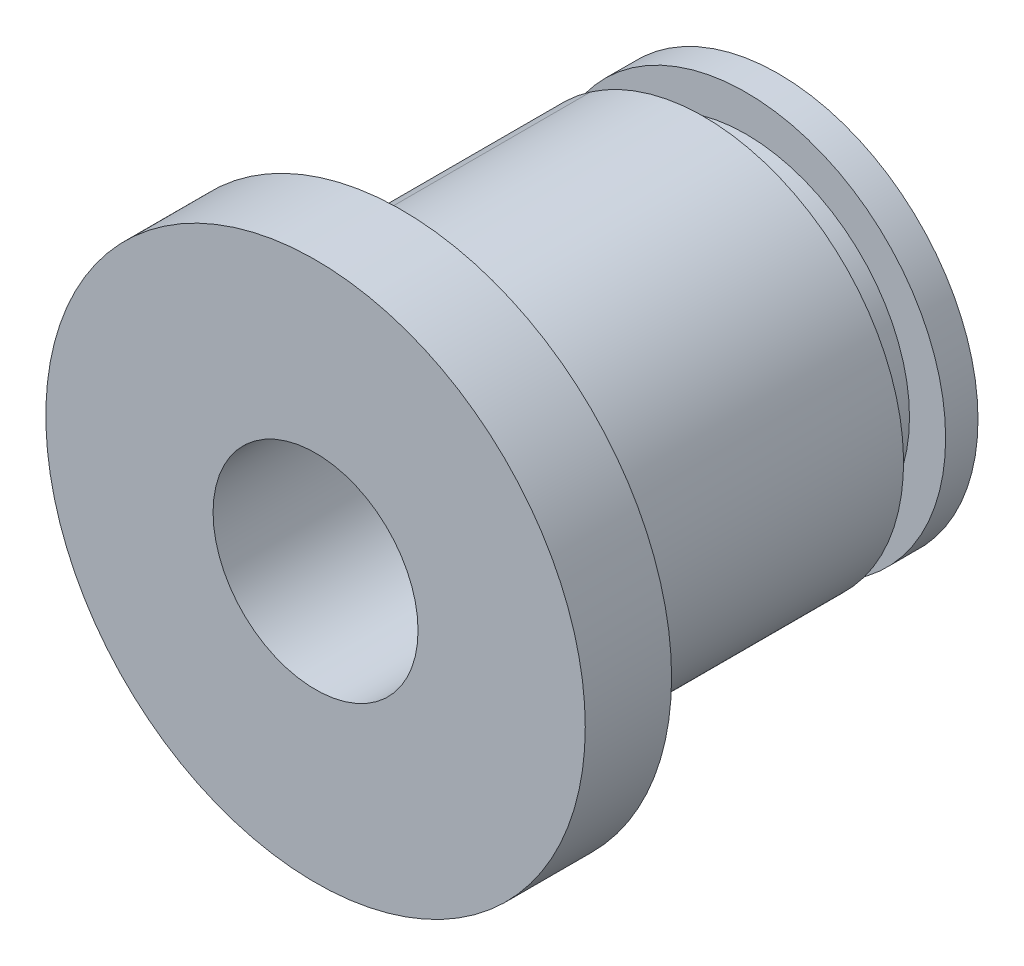
ISO-10303-21;
HEADER;
FILE_DESCRIPTION(('STEP AP214'),'2;1');
FILE_NAME('part.step','',(''),(''),'','','');
FILE_SCHEMA(('AUTOMOTIVE_DESIGN { 1 0 10303 214 1 1 1 1 }'));
ENDSEC;
DATA;
#1=APPLICATION_CONTEXT('core data for automotive mechanical design processes');
#2=APPLICATION_PROTOCOL_DEFINITION('international standard','automotive_design',2000,#1);
#3=PRODUCT_CONTEXT('',#1,'mechanical');
#4=PRODUCT('Part','Part','',(#3));
#5=PRODUCT_RELATED_PRODUCT_CATEGORY('part','',(#4));
#6=PRODUCT_DEFINITION_FORMATION('','',#4);
#7=PRODUCT_DEFINITION_CONTEXT('part definition',#1,'design');
#8=PRODUCT_DEFINITION('design','',#6,#7);
#9=PRODUCT_DEFINITION_SHAPE('','',#8);
#10=(LENGTH_UNIT() NAMED_UNIT(*) SI_UNIT(.MILLI.,.METRE.));
#11=(NAMED_UNIT(*) PLANE_ANGLE_UNIT() SI_UNIT($,.RADIAN.));
#12=(NAMED_UNIT(*) SI_UNIT($,.STERADIAN.) SOLID_ANGLE_UNIT());
#13=UNCERTAINTY_MEASURE_WITH_UNIT(LENGTH_MEASURE(1.E-05),#10,'distance_accuracy_value','');
#14=(GEOMETRIC_REPRESENTATION_CONTEXT(3) GLOBAL_UNCERTAINTY_ASSIGNED_CONTEXT((#13)) GLOBAL_UNIT_ASSIGNED_CONTEXT((#10,
#11,#12)) REPRESENTATION_CONTEXT('',''));
#15=CARTESIAN_POINT('',(0.,0.,0.));
#16=DIRECTION('',(0.,0.,1.));
#17=DIRECTION('',(1.,0.,0.));
#18=AXIS2_PLACEMENT_3D('',#15,#16,#17);
#19=CARTESIAN_POINT('',(0.,0.,-8.8646));
#20=DIRECTION('',(0.,0.,1.));
#21=DIRECTION('',(1.,0.,0.));
#22=AXIS2_PLACEMENT_3D('',#19,#20,#21);
#23=CYLINDRICAL_SURFACE('',#22,4.699);
#24=DIRECTION('',(0.,0.,1.));
#25=VECTOR('',#24,1.);
#26=CARTESIAN_POINT('',(2.64182857750206,-3.88604461722886,-8.8646));
#27=LINE('',#26,#25);
#28=CARTESIAN_POINT('',(2.64182857750206,-3.88604461722886,-7.112));
#29=VERTEX_POINT('',#28);
#30=CARTESIAN_POINT('',(2.64182857750206,-3.88604461722886,0.));
#31=VERTEX_POINT('',#30);
#32=EDGE_CURVE('E11',#29,#31,#27,.T.);
#33=ORIENTED_EDGE('',*,*,#32,.F.);
#34=CARTESIAN_POINT('',(0.,0.,-7.112));
#35=DIRECTION('',(0.,0.,1.));
#36=DIRECTION('',(1.,0.,0.));
#37=AXIS2_PLACEMENT_3D('',#34,#35,#36);
#38=CIRCLE('',#37,4.699);
#39=CARTESIAN_POINT('',(-2.6677771593214,3.86827688101602,-7.112));
#40=VERTEX_POINT('',#39);
#41=EDGE_CURVE('E77',#29,#40,#38,.T.);
#42=ORIENTED_EDGE('',*,*,#41,.T.);
#43=DIRECTION('',(0.,0.,1.));
#44=VECTOR('',#43,1.);
#45=CARTESIAN_POINT('',(-2.6677771593214,3.86827688101602,-8.8646));
#46=LINE('',#45,#44);
#47=CARTESIAN_POINT('',(-2.6677771593214,3.86827688101602,0.));
#48=VERTEX_POINT('',#47);
#49=EDGE_CURVE('E59',#48,#40,#46,.F.);
#50=ORIENTED_EDGE('',*,*,#49,.F.);
#51=CARTESIAN_POINT('',(0.,0.,0.));
#52=DIRECTION('',(0.,0.,-1.));
#53=DIRECTION('',(-1.,0.,0.));
#54=AXIS2_PLACEMENT_3D('',#51,#52,#53);
#55=CIRCLE('',#54,4.699);
#56=EDGE_CURVE('E76',#48,#31,#55,.T.);
#57=ORIENTED_EDGE('',*,*,#56,.T.);
#58=EDGE_LOOP('',(#33,#42,#50,#57));
#59=FACE_BOUND('',#58,.T.);
#60=ADVANCED_FACE('F49',(#59),#23,.T.);
#61=EDGE_CURVE('E121',#40,#29,#38,.T.);
#62=ORIENTED_EDGE('',*,*,#61,.T.);
#63=ORIENTED_EDGE('',*,*,#32,.T.);
#64=EDGE_CURVE('E82',#31,#48,#55,.T.);
#65=ORIENTED_EDGE('',*,*,#64,.T.);
#66=ORIENTED_EDGE('',*,*,#49,.T.);
#67=EDGE_LOOP('',(#62,#63,#65,#66));
#68=FACE_BOUND('',#67,.T.);
#69=ADVANCED_FACE('F83',(#68),#23,.T.);
#70=CARTESIAN_POINT('',(0.,0.,2.032));
#71=DIRECTION('',(0.,0.,-1.));
#72=DIRECTION('',(-1.,0.,0.));
#73=AXIS2_PLACEMENT_3D('',#70,#71,#72);
#74=CYLINDRICAL_SURFACE('',#73,6.35);
#75=CARTESIAN_POINT('',(0.,0.,2.032));
#76=DIRECTION('',(0.,0.,1.));
#77=DIRECTION('',(1.,0.,0.));
#78=AXIS2_PLACEMENT_3D('',#75,#76,#77);
#79=CIRCLE('',#78,6.35);
#80=CARTESIAN_POINT('',(6.35,0.,2.032));
#81=VERTEX_POINT('',#80);
#82=EDGE_CURVE('E86',#81,#81,#79,.T.);
#83=ORIENTED_EDGE('',*,*,#82,.F.);
#84=EDGE_LOOP('',(#83));
#85=FACE_BOUND('',#84,.T.);
#86=CARTESIAN_POINT('',(0.,0.,0.));
#87=DIRECTION('',(0.,0.,1.));
#88=DIRECTION('',(1.,0.,0.));
#89=AXIS2_PLACEMENT_3D('',#86,#87,#88);
#90=CIRCLE('',#89,6.35);
#91=CARTESIAN_POINT('',(6.35,0.,0.));
#92=VERTEX_POINT('',#91);
#93=EDGE_CURVE('E98',#92,#92,#90,.T.);
#94=ORIENTED_EDGE('',*,*,#93,.T.);
#95=EDGE_LOOP('',(#94));
#96=FACE_BOUND('',#95,.T.);
#97=ADVANCED_FACE('F51',(#85,#96),#74,.T.);
#98=CARTESIAN_POINT('',(0.,0.,2.032));
#99=DIRECTION('',(0.,0.,1.));
#100=DIRECTION('',(1.,0.,0.));
#101=AXIS2_PLACEMENT_3D('',#98,#99,#100);
#102=PLANE('',#101);
#103=CARTESIAN_POINT('',(0.,0.,2.032));
#104=DIRECTION('',(0.,0.,1.));
#105=DIRECTION('',(1.,0.,0.));
#106=AXIS2_PLACEMENT_3D('',#103,#104,#105);
#107=CIRCLE('',#106,2.413);
#108=CARTESIAN_POINT('',(2.413,0.,2.032));
#109=VERTEX_POINT('',#108);
#110=EDGE_CURVE('E124',#109,#109,#107,.T.);
#111=ORIENTED_EDGE('',*,*,#110,.F.);
#112=EDGE_LOOP('',(#111));
#113=FACE_BOUND('',#112,.T.);
#114=ORIENTED_EDGE('',*,*,#82,.T.);
#115=EDGE_LOOP('',(#114));
#116=FACE_BOUND('',#115,.T.);
#117=ADVANCED_FACE('F158',(#113,#116),#102,.T.);
#118=CARTESIAN_POINT('',(0.,0.,0.));
#119=DIRECTION('',(0.,0.,1.));
#120=DIRECTION('',(1.,0.,0.));
#121=AXIS2_PLACEMENT_3D('',#118,#119,#120);
#122=PLANE('',#121);
#123=ORIENTED_EDGE('',*,*,#56,.F.);
#124=ORIENTED_EDGE('',*,*,#64,.F.);
#125=EDGE_LOOP('',(#123,#124));
#126=FACE_BOUND('',#125,.T.);
#127=ORIENTED_EDGE('',*,*,#93,.F.);
#128=EDGE_LOOP('',(#127));
#129=FACE_BOUND('',#128,.T.);
#130=ADVANCED_FACE('F88',(#126,#129),#122,.F.);
#131=CARTESIAN_POINT('',(0.,0.,-7.112));
#132=DIRECTION('',(0.,0.,-1.));
#133=DIRECTION('',(-1.,0.,0.));
#134=AXIS2_PLACEMENT_3D('',#131,#132,#133);
#135=PLANE('',#134);
#136=CARTESIAN_POINT('',(0.,0.,-7.112));
#137=DIRECTION('',(0.,0.,1.));
#138=DIRECTION('',(1.,0.,0.));
#139=AXIS2_PLACEMENT_3D('',#136,#137,#138);
#140=CIRCLE('',#139,3.8481);
#141=CARTESIAN_POINT('',(3.8481,0.,-7.112));
#142=VERTEX_POINT('',#141);
#143=EDGE_CURVE('E105',#142,#142,#140,.T.);
#144=ORIENTED_EDGE('',*,*,#143,.T.);
#145=EDGE_LOOP('',(#144));
#146=FACE_BOUND('',#145,.T.);
#147=ORIENTED_EDGE('',*,*,#61,.F.);
#148=ORIENTED_EDGE('',*,*,#41,.F.);
#149=EDGE_LOOP('',(#147,#148));
#150=FACE_BOUND('',#149,.T.);
#151=ADVANCED_FACE('F161',(#146,#150),#135,.T.);
#152=CARTESIAN_POINT('',(0.,0.,6.54906266343876));
#153=DIRECTION('',(0.,0.,1.));
#154=DIRECTION('',(1.,0.,0.));
#155=AXIS2_PLACEMENT_3D('',#152,#153,#154);
#156=CYLINDRICAL_SURFACE('',#155,3.8481);
#157=CARTESIAN_POINT('',(0.,0.,-8.1026));
#158=DIRECTION('',(0.,0.,1.));
#159=DIRECTION('',(1.,0.,0.));
#160=AXIS2_PLACEMENT_3D('',#157,#158,#159);
#161=CIRCLE('',#160,3.8481);
#162=CARTESIAN_POINT('',(3.8481,0.,-8.1026));
#163=VERTEX_POINT('',#162);
#164=EDGE_CURVE('E110',#163,#163,#161,.T.);
#165=ORIENTED_EDGE('',*,*,#164,.T.);
#166=EDGE_LOOP('',(#165));
#167=FACE_BOUND('',#166,.T.);
#168=ORIENTED_EDGE('',*,*,#143,.F.);
#169=EDGE_LOOP('',(#168));
#170=FACE_BOUND('',#169,.T.);
#171=ADVANCED_FACE('F149',(#167,#170),#156,.T.);
#172=CARTESIAN_POINT('',(0.,0.,-8.1026));
#173=DIRECTION('',(0.,0.,-1.));
#174=DIRECTION('',(-1.,0.,0.));
#175=AXIS2_PLACEMENT_3D('',#172,#173,#174);
#176=PLANE('',#175);
#177=ORIENTED_EDGE('',*,*,#164,.F.);
#178=EDGE_LOOP('',(#177));
#179=FACE_BOUND('',#178,.T.);
#180=CARTESIAN_POINT('',(0.,0.,-8.1026));
#181=DIRECTION('',(0.,0.,1.));
#182=DIRECTION('',(1.,0.,0.));
#183=AXIS2_PLACEMENT_3D('',#180,#181,#182);
#184=CIRCLE('',#183,4.699);
#185=CARTESIAN_POINT('',(4.699,0.,-8.1026));
#186=VERTEX_POINT('',#185);
#187=EDGE_CURVE('E115',#186,#186,#184,.T.);
#188=ORIENTED_EDGE('',*,*,#187,.T.);
#189=EDGE_LOOP('',(#188));
#190=FACE_BOUND('',#189,.T.);
#191=ADVANCED_FACE('F139',(#179,#190),#176,.F.);
#192=CARTESIAN_POINT('',(0.,0.,-8.8646));
#193=DIRECTION('',(0.,0.,-1.));
#194=DIRECTION('',(-1.,0.,0.));
#195=AXIS2_PLACEMENT_3D('',#192,#193,#194);
#196=PLANE('',#195);
#197=CARTESIAN_POINT('',(0.,0.,-8.8646));
#198=DIRECTION('',(0.,0.,-1.));
#199=DIRECTION('',(-1.,0.,0.));
#200=AXIS2_PLACEMENT_3D('',#197,#198,#199);
#201=CIRCLE('',#200,2.413);
#202=CARTESIAN_POINT('',(2.413,0.,-8.8646));
#203=VERTEX_POINT('',#202);
#204=EDGE_CURVE('E53',#203,#203,#201,.T.);
#205=ORIENTED_EDGE('',*,*,#204,.F.);
#206=EDGE_LOOP('',(#205));
#207=FACE_BOUND('',#206,.T.);
#208=CARTESIAN_POINT('',(0.,0.,-8.8646));
#209=DIRECTION('',(0.,0.,-1.));
#210=DIRECTION('',(-1.,0.,0.));
#211=AXIS2_PLACEMENT_3D('',#208,#209,#210);
#212=CIRCLE('',#211,4.699);
#213=CARTESIAN_POINT('',(-4.699,0.,-8.8646));
#214=VERTEX_POINT('',#213);
#215=EDGE_CURVE('E93',#214,#214,#212,.T.);
#216=ORIENTED_EDGE('',*,*,#215,.T.);
#217=EDGE_LOOP('',(#216));
#218=FACE_BOUND('',#217,.T.);
#219=ADVANCED_FACE('F136',(#207,#218),#196,.T.);
#220=ORIENTED_EDGE('',*,*,#187,.F.);
#221=EDGE_LOOP('',(#220));
#222=FACE_BOUND('',#221,.T.);
#223=ORIENTED_EDGE('',*,*,#215,.F.);
#224=EDGE_LOOP('',(#223));
#225=FACE_BOUND('',#224,.T.);
#226=ADVANCED_FACE('F138',(#222,#225),#23,.T.);
#227=CARTESIAN_POINT('',(0.,0.,-13.208));
#228=DIRECTION('',(0.,0.,1.));
#229=DIRECTION('',(1.,0.,0.));
#230=AXIS2_PLACEMENT_3D('',#227,#228,#229);
#231=CYLINDRICAL_SURFACE('',#230,2.413);
#232=CARTESIAN_POINT('',(2.413,0.,-8.8646));
#233=CARTESIAN_POINT('',(2.413,0.,-8.75109375));
#234=CARTESIAN_POINT('',(2.413,0.,-8.6375875));
#235=CARTESIAN_POINT('',(2.413,0.,-8.410575));
#236=CARTESIAN_POINT('',(2.413,0.,-8.29706875));
#237=CARTESIAN_POINT('',(2.413,0.,-8.07005625));
#238=CARTESIAN_POINT('',(2.413,0.,-7.95655));
#239=CARTESIAN_POINT('',(2.413,0.,-7.7295375));
#240=CARTESIAN_POINT('',(2.413,0.,-7.61603125));
#241=CARTESIAN_POINT('',(2.413,0.,-7.38901875));
#242=CARTESIAN_POINT('',(2.413,0.,-7.2755125));
#243=CARTESIAN_POINT('',(2.413,0.,-7.0485));
#244=CARTESIAN_POINT('',(2.413,0.,-6.93499375));
#245=CARTESIAN_POINT('',(2.413,0.,-6.70798125));
#246=CARTESIAN_POINT('',(2.413,0.,-6.594475));
#247=CARTESIAN_POINT('',(2.413,0.,-6.3674625));
#248=CARTESIAN_POINT('',(2.413,0.,-6.25395625));
#249=CARTESIAN_POINT('',(2.413,0.,-6.02694375));
#250=CARTESIAN_POINT('',(2.413,0.,-5.9134375));
#251=CARTESIAN_POINT('',(2.413,0.,-5.686425));
#252=CARTESIAN_POINT('',(2.413,0.,-5.57291875));
#253=CARTESIAN_POINT('',(2.413,0.,-5.34590625));
#254=CARTESIAN_POINT('',(2.413,0.,-5.2324));
#255=CARTESIAN_POINT('',(2.413,0.,-5.0053875));
#256=CARTESIAN_POINT('',(2.413,0.,-4.89188125));
#257=CARTESIAN_POINT('',(2.413,0.,-4.66486875));
#258=CARTESIAN_POINT('',(2.413,0.,-4.5513625));
#259=CARTESIAN_POINT('',(2.413,0.,-4.32435));
#260=CARTESIAN_POINT('',(2.413,0.,-4.21084375));
#261=CARTESIAN_POINT('',(2.413,0.,-3.98383125));
#262=CARTESIAN_POINT('',(2.413,0.,-3.870325));
#263=CARTESIAN_POINT('',(2.413,0.,-3.6433125));
#264=CARTESIAN_POINT('',(2.413,0.,-3.52980625));
#265=CARTESIAN_POINT('',(2.413,0.,-3.30279375));
#266=CARTESIAN_POINT('',(2.413,0.,-3.1892875));
#267=CARTESIAN_POINT('',(2.413,0.,-2.962275));
#268=CARTESIAN_POINT('',(2.413,0.,-2.84876875));
#269=CARTESIAN_POINT('',(2.413,0.,-2.62175625));
#270=CARTESIAN_POINT('',(2.413,0.,-2.50825));
#271=CARTESIAN_POINT('',(2.413,0.,-2.2812375));
#272=CARTESIAN_POINT('',(2.413,0.,-2.16773125));
#273=CARTESIAN_POINT('',(2.413,0.,-1.94071875));
#274=CARTESIAN_POINT('',(2.413,0.,-1.8272125));
#275=CARTESIAN_POINT('',(2.413,0.,-1.6002));
#276=CARTESIAN_POINT('',(2.413,0.,-1.48669375));
#277=CARTESIAN_POINT('',(2.413,0.,-1.25968125));
#278=CARTESIAN_POINT('',(2.413,0.,-1.146175));
#279=CARTESIAN_POINT('',(2.413,0.,-0.919162499999999));
#280=CARTESIAN_POINT('',(2.413,0.,-0.805656249999999));
#281=CARTESIAN_POINT('',(2.413,0.,-0.578643749999999));
#282=CARTESIAN_POINT('',(2.413,0.,-0.465137499999999));
#283=CARTESIAN_POINT('',(2.413,0.,-0.238124999999999));
#284=CARTESIAN_POINT('',(2.413,0.,-0.124618749999999));
#285=CARTESIAN_POINT('',(2.413,0.,0.102393750000001));
#286=CARTESIAN_POINT('',(2.413,0.,0.215900000000001));
#287=CARTESIAN_POINT('',(2.413,0.,0.4429125));
#288=CARTESIAN_POINT('',(2.413,0.,0.55641875));
#289=CARTESIAN_POINT('',(2.413,0.,0.78343125));
#290=CARTESIAN_POINT('',(2.413,0.,0.896937500000001));
#291=CARTESIAN_POINT('',(2.413,0.,1.12395));
#292=CARTESIAN_POINT('',(2.413,0.,1.23745625));
#293=CARTESIAN_POINT('',(2.413,0.,1.46446875));
#294=CARTESIAN_POINT('',(2.413,0.,1.577975));
#295=CARTESIAN_POINT('',(2.413,0.,1.8049875));
#296=CARTESIAN_POINT('',(2.413,0.,1.91849375));
#297=CARTESIAN_POINT('',(2.413,0.,2.032));
#298=B_SPLINE_CURVE_WITH_KNOTS('',3,(#232,#233,#234,#235,#236,#237,#238,#239,#240,#241,#242,
#243,#244,#245,#246,#247,#248,#249,#250,#251,#252,#253,#254,#255,#256,#257,#258,#259,#260,#261,
#262,#263,#264,#265,#266,#267,#268,#269,#270,#271,#272,#273,#274,#275,#276,#277,#278,#279,#280,
#281,#282,#283,#284,#285,#286,#287,#288,#289,#290,#291,#292,#293,#294,#295,#296,#297),
.UNSPECIFIED.,.F.,.F.,(4,2,2,2,2,2,2,2,2,2,2,2,2,2,2,2,2,2,2,2,2,2,2,2,2,2,2,2,2,2,2,2,4),(0.,
0.340518749999999,0.681037499999999,1.02155625,1.362075,1.70259375,2.0431125,2.38363125,2.72415,
3.06466875,3.4051875,3.74570625,4.086225,4.42674375,4.7672625,5.10778125,5.4483,5.78881875,
6.1293375,6.46985625,6.810375,7.15089375,7.4914125,7.83193125,8.17245,8.51296875,8.8534875,
9.19400625,9.534525,9.87504375,10.2155625,10.55608125,10.8966),.UNSPECIFIED.);
#299=EDGE_CURVE('BSEAM134',#203,#109,#298,.T.);
#300=ORIENTED_EDGE('',*,*,#204,.T.);
#301=ORIENTED_EDGE('',*,*,#110,.T.);
#302=ORIENTED_EDGE('',*,*,#299,.T.);
#303=ORIENTED_EDGE('',*,*,#299,.F.);
#304=EDGE_LOOP('',(#300,#302,#301,#303));
#305=FACE_BOUND('',#304,.T.);
#306=ADVANCED_FACE('F134',(#305),#231,.F.);
#307=CLOSED_SHELL('',(#60,#69,#97,#117,#130,#151,#171,#191,#219,#226,#306));
#308=MANIFOLD_SOLID_BREP('B2',#307);
#309=ADVANCED_BREP_SHAPE_REPRESENTATION('',(#18,#308),#14);
#310=SHAPE_DEFINITION_REPRESENTATION(#9,#309);
ENDSEC;
END-ISO-10303-21;
